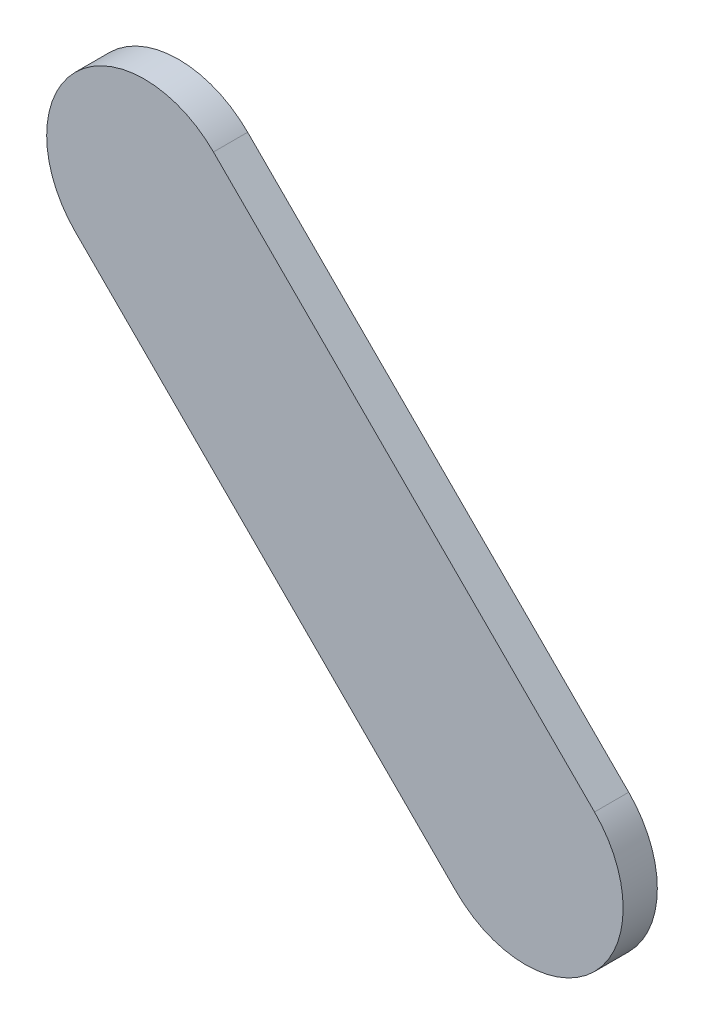
ISO-10303-21;
HEADER;
FILE_DESCRIPTION(('STEP AP214'),'2;1');
FILE_NAME('part.step','',(''),(''),'','','');
FILE_SCHEMA(('AUTOMOTIVE_DESIGN { 1 0 10303 214 1 1 1 1 }'));
ENDSEC;
DATA;
#1=APPLICATION_CONTEXT('core data for automotive mechanical design processes');
#2=APPLICATION_PROTOCOL_DEFINITION('international standard','automotive_design',2000,#1);
#3=PRODUCT_CONTEXT('',#1,'mechanical');
#4=PRODUCT('Part','Part','',(#3));
#5=PRODUCT_RELATED_PRODUCT_CATEGORY('part','',(#4));
#6=PRODUCT_DEFINITION_FORMATION('','',#4);
#7=PRODUCT_DEFINITION_CONTEXT('part definition',#1,'design');
#8=PRODUCT_DEFINITION('design','',#6,#7);
#9=PRODUCT_DEFINITION_SHAPE('','',#8);
#10=(LENGTH_UNIT() NAMED_UNIT(*) SI_UNIT(.MILLI.,.METRE.));
#11=(NAMED_UNIT(*) PLANE_ANGLE_UNIT() SI_UNIT($,.RADIAN.));
#12=(NAMED_UNIT(*) SI_UNIT($,.STERADIAN.) SOLID_ANGLE_UNIT());
#13=UNCERTAINTY_MEASURE_WITH_UNIT(LENGTH_MEASURE(1.E-05),#10,'distance_accuracy_value','');
#14=(GEOMETRIC_REPRESENTATION_CONTEXT(3) GLOBAL_UNCERTAINTY_ASSIGNED_CONTEXT((#13)) GLOBAL_UNIT_ASSIGNED_CONTEXT((#10,
#11,#12)) REPRESENTATION_CONTEXT('',''));
#15=CARTESIAN_POINT('',(0.,0.,0.));
#16=DIRECTION('',(0.,0.,1.));
#17=DIRECTION('',(1.,0.,0.));
#18=AXIS2_PLACEMENT_3D('',#15,#16,#17);
#19=CARTESIAN_POINT('',(82.489289,-123.364576,1.635));
#20=DIRECTION('',(0.,0.,1.));
#21=DIRECTION('',(1.,0.,0.));
#22=AXIS2_PLACEMENT_3D('',#19,#20,#21);
#23=PLANE('',#22);
#24=DIRECTION('',(0.707106781186548,-0.707106781186548,0.));
#25=VECTOR('',#24,1.);
#26=CARTESIAN_POINT('',(82.489289,-123.364576,1.635));
#27=LINE('',#26,#25);
#28=CARTESIAN_POINT('',(82.489289,-123.364576,1.635));
#29=VERTEX_POINT('',#28);
#30=CARTESIAN_POINT('',(82.879289,-123.754576,1.635));
#31=VERTEX_POINT('',#30);
#32=EDGE_CURVE('E84',#29,#31,#27,.T.);
#33=ORIENTED_EDGE('',*,*,#32,.T.);
#34=CARTESIAN_POINT('',(82.9499995,-123.6838655,1.635));
#35=DIRECTION('',(0.,0.,1.));
#36=DIRECTION('',(-0.707106781186048,-0.707106781187048,0.));
#37=AXIS2_PLACEMENT_3D('',#34,#35,#36);
#38=CIRCLE('',#37,0.09999974810218);
#39=CARTESIAN_POINT('',(83.02071,-123.613155,1.635));
#40=VERTEX_POINT('',#39);
#41=EDGE_CURVE('E82',#31,#40,#38,.T.);
#42=ORIENTED_EDGE('',*,*,#41,.T.);
#43=DIRECTION('',(-0.707106781186548,0.707106781186548,0.));
#44=VECTOR('',#43,1.);
#45=CARTESIAN_POINT('',(83.02071,-123.613155,1.635));
#46=LINE('',#45,#44);
#47=CARTESIAN_POINT('',(82.63071,-123.223155,1.635));
#48=VERTEX_POINT('',#47);
#49=EDGE_CURVE('E72',#40,#48,#46,.T.);
#50=ORIENTED_EDGE('',*,*,#49,.T.);
#51=CARTESIAN_POINT('',(82.5599995,-123.2938655,1.635));
#52=DIRECTION('',(0.,0.,1.));
#53=DIRECTION('',(0.707106781186048,0.707106781187048,0.));
#54=AXIS2_PLACEMENT_3D('',#51,#52,#53);
#55=CIRCLE('',#54,0.09999974810218);
#56=EDGE_CURVE('E11',#48,#29,#55,.T.);
#57=ORIENTED_EDGE('',*,*,#56,.T.);
#58=EDGE_LOOP('',(#33,#42,#50,#57));
#59=FACE_BOUND('',#58,.T.);
#60=ADVANCED_FACE('F17',(#59),#23,.T.);
#61=CARTESIAN_POINT('',(82.489289,-123.364576,1.6));
#62=DIRECTION('',(0.,0.,1.));
#63=DIRECTION('',(1.,0.,0.));
#64=AXIS2_PLACEMENT_3D('',#61,#62,#63);
#65=PLANE('',#64);
#66=CARTESIAN_POINT('',(82.5599995,-123.2938655,1.6));
#67=DIRECTION('',(0.,0.,1.));
#68=DIRECTION('',(0.707106781186048,0.707106781187048,0.));
#69=AXIS2_PLACEMENT_3D('',#66,#67,#68);
#70=CIRCLE('',#69,0.09999974810218);
#71=CARTESIAN_POINT('',(82.63071,-123.223155,1.6));
#72=VERTEX_POINT('',#71);
#73=CARTESIAN_POINT('',(82.489289,-123.364576,1.6));
#74=VERTEX_POINT('',#73);
#75=EDGE_CURVE('E21',#72,#74,#70,.T.);
#76=ORIENTED_EDGE('',*,*,#75,.F.);
#77=DIRECTION('',(-0.707106781186548,0.707106781186548,0.));
#78=VECTOR('',#77,1.);
#79=CARTESIAN_POINT('',(83.02071,-123.613155,1.6));
#80=LINE('',#79,#78);
#81=CARTESIAN_POINT('',(83.02071,-123.613155,1.6));
#82=VERTEX_POINT('',#81);
#83=EDGE_CURVE('E65',#82,#72,#80,.T.);
#84=ORIENTED_EDGE('',*,*,#83,.F.);
#85=CARTESIAN_POINT('',(82.9499995,-123.6838655,1.6));
#86=DIRECTION('',(0.,0.,1.));
#87=DIRECTION('',(-0.707106781186048,-0.707106781187048,0.));
#88=AXIS2_PLACEMENT_3D('',#85,#86,#87);
#89=CIRCLE('',#88,0.09999974810218);
#90=CARTESIAN_POINT('',(82.879289,-123.754576,1.6));
#91=VERTEX_POINT('',#90);
#92=EDGE_CURVE('E91',#91,#82,#89,.T.);
#93=ORIENTED_EDGE('',*,*,#92,.F.);
#94=DIRECTION('',(0.707106781186548,-0.707106781186548,0.));
#95=VECTOR('',#94,1.);
#96=CARTESIAN_POINT('',(82.489289,-123.364576,1.6));
#97=LINE('',#96,#95);
#98=EDGE_CURVE('E122',#74,#91,#97,.T.);
#99=ORIENTED_EDGE('',*,*,#98,.F.);
#100=EDGE_LOOP('',(#76,#84,#93,#99));
#101=FACE_BOUND('',#100,.T.);
#102=ADVANCED_FACE('F173',(#101),#65,.F.);
#103=CARTESIAN_POINT('',(82.5599995,-123.2938655,1.6));
#104=DIRECTION('',(0.,0.,-1.));
#105=DIRECTION('',(0.707106781186048,0.707106781187048,0.));
#106=AXIS2_PLACEMENT_3D('',#103,#104,#105);
#107=CYLINDRICAL_SURFACE('',#106,0.09999974810218);
#108=ORIENTED_EDGE('',*,*,#75,.T.);
#109=DIRECTION('',(0.,0.,1.));
#110=VECTOR('',#109,1.);
#111=CARTESIAN_POINT('',(82.489289,-123.364576,1.6));
#112=LINE('',#111,#110);
#113=EDGE_CURVE('E98',#74,#29,#112,.T.);
#114=ORIENTED_EDGE('',*,*,#113,.T.);
#115=ORIENTED_EDGE('',*,*,#56,.F.);
#116=DIRECTION('',(0.,0.,1.));
#117=VECTOR('',#116,1.);
#118=CARTESIAN_POINT('',(82.63071,-123.223155,1.6));
#119=LINE('',#118,#117);
#120=EDGE_CURVE('E78',#72,#48,#119,.T.);
#121=ORIENTED_EDGE('',*,*,#120,.F.);
#122=EDGE_LOOP('',(#108,#114,#115,#121));
#123=FACE_BOUND('',#122,.T.);
#124=ADVANCED_FACE('F19',(#123),#107,.T.);
#125=CARTESIAN_POINT('',(83.02071,-123.613155,1.6));
#126=DIRECTION('',(-0.707106781186548,-0.707106781186548,0.));
#127=DIRECTION('',(-0.707106781186548,0.707106781186548,0.));
#128=AXIS2_PLACEMENT_3D('',#125,#126,#127);
#129=PLANE('',#128);
#130=ORIENTED_EDGE('',*,*,#83,.T.);
#131=ORIENTED_EDGE('',*,*,#120,.T.);
#132=ORIENTED_EDGE('',*,*,#49,.F.);
#133=DIRECTION('',(0.,0.,1.));
#134=VECTOR('',#133,1.);
#135=CARTESIAN_POINT('',(83.02071,-123.613155,1.6));
#136=LINE('',#135,#134);
#137=EDGE_CURVE('E76',#82,#40,#136,.T.);
#138=ORIENTED_EDGE('',*,*,#137,.F.);
#139=EDGE_LOOP('',(#130,#131,#132,#138));
#140=FACE_BOUND('',#139,.T.);
#141=ADVANCED_FACE('F74',(#140),#129,.F.);
#142=CARTESIAN_POINT('',(82.9499995,-123.6838655,1.6));
#143=DIRECTION('',(0.,0.,-1.));
#144=DIRECTION('',(-0.707106781186048,-0.707106781187048,0.));
#145=AXIS2_PLACEMENT_3D('',#142,#143,#144);
#146=CYLINDRICAL_SURFACE('',#145,0.09999974810218);
#147=ORIENTED_EDGE('',*,*,#92,.T.);
#148=ORIENTED_EDGE('',*,*,#137,.T.);
#149=ORIENTED_EDGE('',*,*,#41,.F.);
#150=DIRECTION('',(0.,0.,1.));
#151=VECTOR('',#150,1.);
#152=CARTESIAN_POINT('',(82.879289,-123.754576,1.6));
#153=LINE('',#152,#151);
#154=EDGE_CURVE('E111',#91,#31,#153,.T.);
#155=ORIENTED_EDGE('',*,*,#154,.F.);
#156=EDGE_LOOP('',(#147,#148,#149,#155));
#157=FACE_BOUND('',#156,.T.);
#158=ADVANCED_FACE('F90',(#157),#146,.T.);
#159=CARTESIAN_POINT('',(82.489289,-123.364576,1.6));
#160=DIRECTION('',(0.707106781186548,0.707106781186548,0.));
#161=DIRECTION('',(0.,0.,-1.));
#162=AXIS2_PLACEMENT_3D('',#159,#160,#161);
#163=PLANE('',#162);
#164=ORIENTED_EDGE('',*,*,#98,.T.);
#165=ORIENTED_EDGE('',*,*,#154,.T.);
#166=ORIENTED_EDGE('',*,*,#32,.F.);
#167=ORIENTED_EDGE('',*,*,#113,.F.);
#168=EDGE_LOOP('',(#164,#165,#166,#167));
#169=FACE_BOUND('',#168,.T.);
#170=ADVANCED_FACE('F121',(#169),#163,.F.);
#171=CLOSED_SHELL('',(#60,#102,#124,#141,#158,#170));
#172=MANIFOLD_SOLID_BREP('B1',#171);
#173=ADVANCED_BREP_SHAPE_REPRESENTATION('',(#18,#172),#14);
#174=SHAPE_DEFINITION_REPRESENTATION(#9,#173);
ENDSEC;
END-ISO-10303-21;
